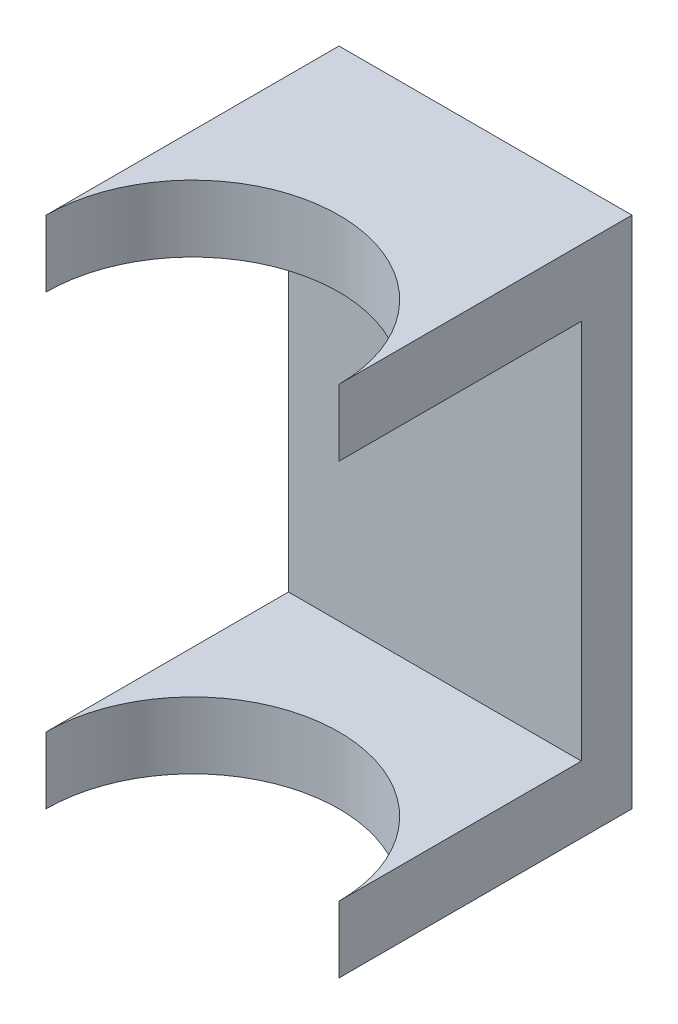
ISO-10303-21;
HEADER;
FILE_DESCRIPTION(('STEP AP214'),'2;1');
FILE_NAME('part.step','',(''),(''),'','','');
FILE_SCHEMA(('AUTOMOTIVE_DESIGN { 1 0 10303 214 1 1 1 1 }'));
ENDSEC;
DATA;
#1=APPLICATION_CONTEXT('core data for automotive mechanical design processes');
#2=APPLICATION_PROTOCOL_DEFINITION('international standard','automotive_design',2000,#1);
#3=PRODUCT_CONTEXT('',#1,'mechanical');
#4=PRODUCT('Part','Part','',(#3));
#5=PRODUCT_RELATED_PRODUCT_CATEGORY('part','',(#4));
#6=PRODUCT_DEFINITION_FORMATION('','',#4);
#7=PRODUCT_DEFINITION_CONTEXT('part definition',#1,'design');
#8=PRODUCT_DEFINITION('design','',#6,#7);
#9=PRODUCT_DEFINITION_SHAPE('','',#8);
#10=(LENGTH_UNIT() NAMED_UNIT(*) SI_UNIT(.MILLI.,.METRE.));
#11=(NAMED_UNIT(*) PLANE_ANGLE_UNIT() SI_UNIT($,.RADIAN.));
#12=(NAMED_UNIT(*) SI_UNIT($,.STERADIAN.) SOLID_ANGLE_UNIT());
#13=UNCERTAINTY_MEASURE_WITH_UNIT(LENGTH_MEASURE(1.E-05),#10,'distance_accuracy_value','');
#14=(GEOMETRIC_REPRESENTATION_CONTEXT(3) GLOBAL_UNCERTAINTY_ASSIGNED_CONTEXT((#13)) GLOBAL_UNIT_ASSIGNED_CONTEXT((#10,
#11,#12)) REPRESENTATION_CONTEXT('',''));
#15=CARTESIAN_POINT('',(0.,0.,0.));
#16=DIRECTION('',(0.,0.,1.));
#17=DIRECTION('',(1.,0.,0.));
#18=AXIS2_PLACEMENT_3D('',#15,#16,#17);
#19=CARTESIAN_POINT('',(12.5249542932875,90.424,32.9041520314548));
#20=DIRECTION('',(0.,1.,0.));
#21=DIRECTION('',(-1.,0.,0.));
#22=AXIS2_PLACEMENT_3D('',#19,#20,#21);
#23=PLANE('',#22);
#24=DIRECTION('',(-1.,0.,0.));
#25=VECTOR('',#24,1.);
#26=CARTESIAN_POINT('',(-46.6570457067125,90.424,-16.0720300587913));
#27=LINE('',#26,#25);
#28=CARTESIAN_POINT('',(12.5249542932875,90.424,-16.0720300587913));
#29=VERTEX_POINT('',#28);
#30=CARTESIAN_POINT('',(-46.6570457067125,90.424,-16.0720300587913));
#31=VERTEX_POINT('',#30);
#32=EDGE_CURVE('E53',#29,#31,#27,.T.);
#33=ORIENTED_EDGE('',*,*,#32,.F.);
#34=DIRECTION('',(0.,0.,-1.));
#35=VECTOR('',#34,1.);
#36=CARTESIAN_POINT('',(12.5249542932875,90.424,32.9041520314548));
#37=LINE('',#36,#35);
#38=CARTESIAN_POINT('',(12.5249542932875,90.424,32.9041520314548));
#39=VERTEX_POINT('',#38);
#40=EDGE_CURVE('E155',#39,#29,#37,.T.);
#41=ORIENTED_EDGE('',*,*,#40,.F.);
#42=CARTESIAN_POINT('',(-17.0660457067125,90.424,32.9041520314548));
#43=DIRECTION('',(0.,1.,0.));
#44=DIRECTION('',(-1.,0.,0.));
#45=AXIS2_PLACEMENT_3D('',#42,#43,#44);
#46=CIRCLE('',#45,29.591);
#47=CARTESIAN_POINT('',(-46.6570457067125,90.424,32.9041520314548));
#48=VERTEX_POINT('',#47);
#49=EDGE_CURVE('E58',#48,#39,#46,.F.);
#50=ORIENTED_EDGE('',*,*,#49,.F.);
#51=DIRECTION('',(0.,0.,-1.));
#52=VECTOR('',#51,1.);
#53=CARTESIAN_POINT('',(-46.6570457067125,90.424,32.9041520314548));
#54=LINE('',#53,#52);
#55=EDGE_CURVE('E11',#48,#31,#54,.T.);
#56=ORIENTED_EDGE('',*,*,#55,.T.);
#57=EDGE_LOOP('',(#33,#41,#50,#56));
#58=FACE_BOUND('',#57,.T.);
#59=ADVANCED_FACE('F37',(#58),#23,.F.);
#60=CARTESIAN_POINT('',(-46.6570457067125,103.886,-26.2778479685452));
#61=DIRECTION('',(1.,0.,0.));
#62=DIRECTION('',(0.,0.,-1.));
#63=AXIS2_PLACEMENT_3D('',#60,#61,#62);
#64=PLANE('',#63);
#65=DIRECTION('',(0.,-1.,0.));
#66=VECTOR('',#65,1.);
#67=CARTESIAN_POINT('',(-46.6570457067125,103.886,-26.2778479685452));
#68=LINE('',#67,#66);
#69=CARTESIAN_POINT('',(-46.6570457067125,103.886,-26.2778479685452));
#70=VERTEX_POINT('',#69);
#71=CARTESIAN_POINT('',(-46.6570457067125,0.,-26.2778479685452));
#72=VERTEX_POINT('',#71);
#73=EDGE_CURVE('E41',#70,#72,#68,.T.);
#74=ORIENTED_EDGE('',*,*,#73,.T.);
#75=DIRECTION('',(0.,0.,1.));
#76=VECTOR('',#75,1.);
#77=CARTESIAN_POINT('',(-46.6570457067125,0.,-26.2778479685452));
#78=LINE('',#77,#76);
#79=CARTESIAN_POINT('',(-46.6570457067125,0.,32.9041520314548));
#80=VERTEX_POINT('',#79);
#81=EDGE_CURVE('E170',#72,#80,#78,.T.);
#82=ORIENTED_EDGE('',*,*,#81,.T.);
#83=DIRECTION('',(0.,-1.,0.));
#84=VECTOR('',#83,1.);
#85=CARTESIAN_POINT('',(-46.6570457067125,103.886,32.9041520314548));
#86=LINE('',#85,#84);
#87=CARTESIAN_POINT('',(-46.6570457067125,13.462,32.9041520314548));
#88=VERTEX_POINT('',#87);
#89=EDGE_CURVE('E127',#88,#80,#86,.T.);
#90=ORIENTED_EDGE('',*,*,#89,.F.);
#91=DIRECTION('',(0.,0.,-1.));
#92=VECTOR('',#91,1.);
#93=CARTESIAN_POINT('',(-46.6570457067125,13.462,32.9041520314548));
#94=LINE('',#93,#92);
#95=CARTESIAN_POINT('',(-46.6570457067125,13.462,-16.0720300587913));
#96=VERTEX_POINT('',#95);
#97=EDGE_CURVE('E108',#88,#96,#94,.T.);
#98=ORIENTED_EDGE('',*,*,#97,.T.);
#99=DIRECTION('',(0.,1.,0.));
#100=VECTOR('',#99,1.);
#101=CARTESIAN_POINT('',(-46.6570457067125,13.462,-16.0720300587913));
#102=LINE('',#101,#100);
#103=EDGE_CURVE('E139',#96,#31,#102,.T.);
#104=ORIENTED_EDGE('',*,*,#103,.T.);
#105=ORIENTED_EDGE('',*,*,#55,.F.);
#106=DIRECTION('',(0.,-1.,0.));
#107=VECTOR('',#106,1.);
#108=CARTESIAN_POINT('',(-46.6570457067125,103.886,32.9041520314548));
#109=LINE('',#108,#107);
#110=CARTESIAN_POINT('',(-46.6570457067125,103.886,32.9041520314548));
#111=VERTEX_POINT('',#110);
#112=EDGE_CURVE('E146',#111,#48,#109,.T.);
#113=ORIENTED_EDGE('',*,*,#112,.F.);
#114=DIRECTION('',(0.,0.,1.));
#115=VECTOR('',#114,1.);
#116=CARTESIAN_POINT('',(-46.6570457067125,103.886,-26.2778479685452));
#117=LINE('',#116,#115);
#118=EDGE_CURVE('E46',#70,#111,#117,.T.);
#119=ORIENTED_EDGE('',*,*,#118,.F.);
#120=EDGE_LOOP('',(#74,#82,#90,#98,#104,#105,#113,#119));
#121=FACE_BOUND('',#120,.T.);
#122=ADVANCED_FACE('F39',(#121),#64,.F.);
#123=CARTESIAN_POINT('',(12.5249542932875,103.886,-26.2778479685452));
#124=DIRECTION('',(-1.,0.,0.));
#125=DIRECTION('',(0.,0.,1.));
#126=AXIS2_PLACEMENT_3D('',#123,#124,#125);
#127=PLANE('',#126);
#128=DIRECTION('',(0.,-1.,0.));
#129=VECTOR('',#128,1.);
#130=CARTESIAN_POINT('',(12.5249542932875,103.886,32.9041520314548));
#131=LINE('',#130,#129);
#132=CARTESIAN_POINT('',(12.5249542932875,103.886,32.9041520314548));
#133=VERTEX_POINT('',#132);
#134=EDGE_CURVE('E158',#133,#39,#131,.T.);
#135=ORIENTED_EDGE('',*,*,#134,.T.);
#136=ORIENTED_EDGE('',*,*,#40,.T.);
#137=DIRECTION('',(0.,1.,0.));
#138=VECTOR('',#137,1.);
#139=CARTESIAN_POINT('',(12.5249542932875,13.462,-16.0720300587913));
#140=LINE('',#139,#138);
#141=CARTESIAN_POINT('',(12.5249542932875,13.462,-16.0720300587913));
#142=VERTEX_POINT('',#141);
#143=EDGE_CURVE('E121',#142,#29,#140,.T.);
#144=ORIENTED_EDGE('',*,*,#143,.F.);
#145=DIRECTION('',(0.,0.,-1.));
#146=VECTOR('',#145,1.);
#147=CARTESIAN_POINT('',(12.5249542932874,13.462,32.9041520314548));
#148=LINE('',#147,#146);
#149=CARTESIAN_POINT('',(12.5249542932874,13.462,32.9041520314548));
#150=VERTEX_POINT('',#149);
#151=EDGE_CURVE('E106',#150,#142,#148,.T.);
#152=ORIENTED_EDGE('',*,*,#151,.F.);
#153=DIRECTION('',(0.,-1.,0.));
#154=VECTOR('',#153,1.);
#155=CARTESIAN_POINT('',(12.5249542932875,103.886,32.9041520314548));
#156=LINE('',#155,#154);
#157=CARTESIAN_POINT('',(12.5249542932875,0.,32.9041520314548));
#158=VERTEX_POINT('',#157);
#159=EDGE_CURVE('E118',#150,#158,#156,.T.);
#160=ORIENTED_EDGE('',*,*,#159,.T.);
#161=DIRECTION('',(0.,0.,-1.));
#162=VECTOR('',#161,1.);
#163=CARTESIAN_POINT('',(12.5249542932875,0.,-26.2778479685452));
#164=LINE('',#163,#162);
#165=CARTESIAN_POINT('',(12.5249542932875,0.,-26.2778479685452));
#166=VERTEX_POINT('',#165);
#167=EDGE_CURVE('E132',#158,#166,#164,.T.);
#168=ORIENTED_EDGE('',*,*,#167,.T.);
#169=DIRECTION('',(0.,-1.,0.));
#170=VECTOR('',#169,1.);
#171=CARTESIAN_POINT('',(12.5249542932875,103.886,-26.2778479685452));
#172=LINE('',#171,#170);
#173=CARTESIAN_POINT('',(12.5249542932875,103.886,-26.2778479685452));
#174=VERTEX_POINT('',#173);
#175=EDGE_CURVE('E157',#174,#166,#172,.T.);
#176=ORIENTED_EDGE('',*,*,#175,.F.);
#177=DIRECTION('',(0.,0.,-1.));
#178=VECTOR('',#177,1.);
#179=CARTESIAN_POINT('',(12.5249542932875,103.886,-26.2778479685452));
#180=LINE('',#179,#178);
#181=EDGE_CURVE('E149',#133,#174,#180,.T.);
#182=ORIENTED_EDGE('',*,*,#181,.F.);
#183=EDGE_LOOP('',(#135,#136,#144,#152,#160,#168,#176,#182));
#184=FACE_BOUND('',#183,.T.);
#185=ADVANCED_FACE('F116',(#184),#127,.F.);
#186=CARTESIAN_POINT('',(-46.6570457067125,103.886,-26.2778479685452));
#187=DIRECTION('',(0.,0.,1.));
#188=DIRECTION('',(1.,0.,0.));
#189=AXIS2_PLACEMENT_3D('',#186,#187,#188);
#190=PLANE('',#189);
#191=ORIENTED_EDGE('',*,*,#175,.T.);
#192=DIRECTION('',(-1.,0.,0.));
#193=VECTOR('',#192,1.);
#194=CARTESIAN_POINT('',(-46.6570457067125,0.,-26.2778479685452));
#195=LINE('',#194,#193);
#196=EDGE_CURVE('E128',#166,#72,#195,.T.);
#197=ORIENTED_EDGE('',*,*,#196,.T.);
#198=ORIENTED_EDGE('',*,*,#73,.F.);
#199=DIRECTION('',(-1.,0.,0.));
#200=VECTOR('',#199,1.);
#201=CARTESIAN_POINT('',(-46.6570457067125,103.886,-26.2778479685452));
#202=LINE('',#201,#200);
#203=EDGE_CURVE('E147',#174,#70,#202,.T.);
#204=ORIENTED_EDGE('',*,*,#203,.F.);
#205=EDGE_LOOP('',(#191,#197,#198,#204));
#206=FACE_BOUND('',#205,.T.);
#207=ADVANCED_FACE('F164',(#206),#190,.F.);
#208=CARTESIAN_POINT('',(-17.0660457067125,103.886,32.9041520314548));
#209=DIRECTION('',(0.,-1.,0.));
#210=DIRECTION('',(0.,0.,-1.));
#211=AXIS2_PLACEMENT_3D('',#208,#209,#210);
#212=CYLINDRICAL_SURFACE('',#211,29.591);
#213=ORIENTED_EDGE('',*,*,#112,.T.);
#214=ORIENTED_EDGE('',*,*,#49,.T.);
#215=ORIENTED_EDGE('',*,*,#134,.F.);
#216=CARTESIAN_POINT('',(-17.0660457067125,103.886,32.9041520314548));
#217=DIRECTION('',(0.,-1.,0.));
#218=DIRECTION('',(0.,0.,-1.));
#219=AXIS2_PLACEMENT_3D('',#216,#217,#218);
#220=CIRCLE('',#219,29.591);
#221=EDGE_CURVE('E145',#111,#133,#220,.T.);
#222=ORIENTED_EDGE('',*,*,#221,.F.);
#223=EDGE_LOOP('',(#213,#214,#215,#222));
#224=FACE_BOUND('',#223,.T.);
#225=ADVANCED_FACE('F187',(#224),#212,.F.);
#226=CARTESIAN_POINT('',(0.,103.886,0.));
#227=DIRECTION('',(0.,1.,0.));
#228=DIRECTION('',(0.,0.,1.));
#229=AXIS2_PLACEMENT_3D('',#226,#227,#228);
#230=PLANE('',#229);
#231=ORIENTED_EDGE('',*,*,#221,.T.);
#232=ORIENTED_EDGE('',*,*,#181,.T.);
#233=ORIENTED_EDGE('',*,*,#203,.T.);
#234=ORIENTED_EDGE('',*,*,#118,.T.);
#235=EDGE_LOOP('',(#231,#232,#233,#234));
#236=FACE_BOUND('',#235,.T.);
#237=ADVANCED_FACE('F180',(#236),#230,.T.);
#238=CARTESIAN_POINT('',(-46.6570457067125,13.462,-16.0720300587913));
#239=DIRECTION('',(0.,0.,-1.));
#240=DIRECTION('',(-1.,0.,0.));
#241=AXIS2_PLACEMENT_3D('',#238,#239,#240);
#242=PLANE('',#241);
#243=ORIENTED_EDGE('',*,*,#32,.T.);
#244=ORIENTED_EDGE('',*,*,#103,.F.);
#245=DIRECTION('',(-1.,0.,0.));
#246=VECTOR('',#245,1.);
#247=CARTESIAN_POINT('',(-46.6570457067125,13.462,-16.0720300587913));
#248=LINE('',#247,#246);
#249=EDGE_CURVE('E137',#142,#96,#248,.T.);
#250=ORIENTED_EDGE('',*,*,#249,.F.);
#251=ORIENTED_EDGE('',*,*,#143,.T.);
#252=EDGE_LOOP('',(#243,#244,#250,#251));
#253=FACE_BOUND('',#252,.T.);
#254=ADVANCED_FACE('F178',(#253),#242,.F.);
#255=CARTESIAN_POINT('',(12.5249542932874,13.462,32.9041520314548));
#256=DIRECTION('',(0.,-1.,0.));
#257=DIRECTION('',(0.,0.,-1.));
#258=AXIS2_PLACEMENT_3D('',#255,#256,#257);
#259=PLANE('',#258);
#260=ORIENTED_EDGE('',*,*,#151,.T.);
#261=ORIENTED_EDGE('',*,*,#249,.T.);
#262=ORIENTED_EDGE('',*,*,#97,.F.);
#263=CARTESIAN_POINT('',(-17.0660457067125,13.462,32.9041520314548));
#264=DIRECTION('',(0.,-1.,0.));
#265=DIRECTION('',(0.,0.,-1.));
#266=AXIS2_PLACEMENT_3D('',#263,#264,#265);
#267=CIRCLE('',#266,29.591);
#268=EDGE_CURVE('E102',#150,#88,#267,.F.);
#269=ORIENTED_EDGE('',*,*,#268,.F.);
#270=EDGE_LOOP('',(#260,#261,#262,#269));
#271=FACE_BOUND('',#270,.T.);
#272=ADVANCED_FACE('F104',(#271),#259,.F.);
#273=CARTESIAN_POINT('',(0.,0.,0.));
#274=DIRECTION('',(0.,1.,0.));
#275=DIRECTION('',(0.,0.,1.));
#276=AXIS2_PLACEMENT_3D('',#273,#274,#275);
#277=PLANE('',#276);
#278=ORIENTED_EDGE('',*,*,#167,.F.);
#279=CARTESIAN_POINT('',(-17.0660457067125,0.,32.9041520314548));
#280=DIRECTION('',(0.,1.,0.));
#281=DIRECTION('',(0.,0.,1.));
#282=AXIS2_PLACEMENT_3D('',#279,#280,#281);
#283=CIRCLE('',#282,29.591);
#284=EDGE_CURVE('E112',#158,#80,#283,.T.);
#285=ORIENTED_EDGE('',*,*,#284,.T.);
#286=ORIENTED_EDGE('',*,*,#81,.F.);
#287=ORIENTED_EDGE('',*,*,#196,.F.);
#288=EDGE_LOOP('',(#278,#285,#286,#287));
#289=FACE_BOUND('',#288,.T.);
#290=ADVANCED_FACE('F171',(#289),#277,.F.);
#291=CARTESIAN_POINT('',(-17.0660457067125,103.886,32.9041520314548));
#292=DIRECTION('',(0.,-1.,0.));
#293=DIRECTION('',(0.,0.,-1.));
#294=AXIS2_PLACEMENT_3D('',#291,#292,#293);
#295=CYLINDRICAL_SURFACE('',#294,29.591);
#296=ORIENTED_EDGE('',*,*,#159,.F.);
#297=ORIENTED_EDGE('',*,*,#268,.T.);
#298=ORIENTED_EDGE('',*,*,#89,.T.);
#299=ORIENTED_EDGE('',*,*,#284,.F.);
#300=EDGE_LOOP('',(#296,#297,#298,#299));
#301=FACE_BOUND('',#300,.T.);
#302=ADVANCED_FACE('F124',(#301),#295,.F.);
#303=CLOSED_SHELL('',(#59,#122,#185,#207,#225,#237,#254,#272,#290,#302));
#304=MANIFOLD_SOLID_BREP('B2',#303);
#305=ADVANCED_BREP_SHAPE_REPRESENTATION('',(#18,#304),#14);
#306=SHAPE_DEFINITION_REPRESENTATION(#9,#305);
ENDSEC;
END-ISO-10303-21;
